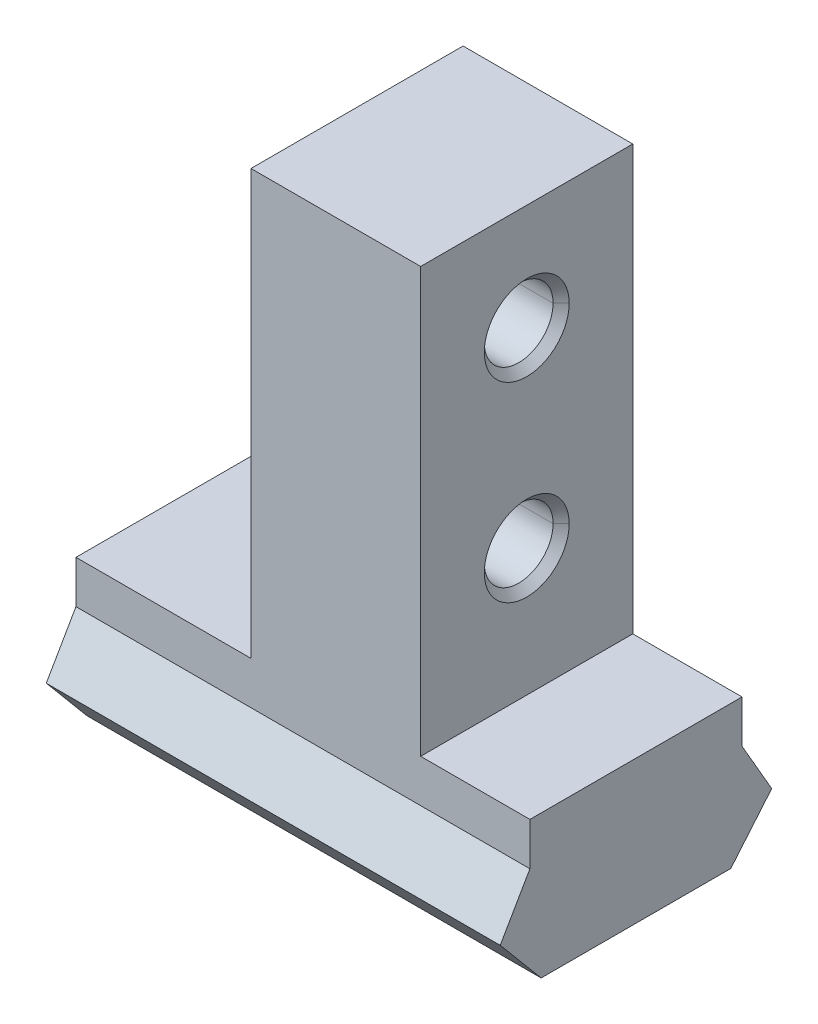
ISO-10303-21;
HEADER;
FILE_DESCRIPTION(('STEP AP214'),'2;1');
FILE_NAME('part.step','',(''),(''),'','','');
FILE_SCHEMA(('AUTOMOTIVE_DESIGN { 1 0 10303 214 1 1 1 1 }'));
ENDSEC;
DATA;
#1=APPLICATION_CONTEXT('core data for automotive mechanical design processes');
#2=APPLICATION_PROTOCOL_DEFINITION('international standard','automotive_design',2000,#1);
#3=PRODUCT_CONTEXT('',#1,'mechanical');
#4=PRODUCT('Part','Part','',(#3));
#5=PRODUCT_RELATED_PRODUCT_CATEGORY('part','',(#4));
#6=PRODUCT_DEFINITION_FORMATION('','',#4);
#7=PRODUCT_DEFINITION_CONTEXT('part definition',#1,'design');
#8=PRODUCT_DEFINITION('design','',#6,#7);
#9=PRODUCT_DEFINITION_SHAPE('','',#8);
#10=(LENGTH_UNIT() NAMED_UNIT(*) SI_UNIT(.MILLI.,.METRE.));
#11=(NAMED_UNIT(*) PLANE_ANGLE_UNIT() SI_UNIT($,.RADIAN.));
#12=(NAMED_UNIT(*) SI_UNIT($,.STERADIAN.) SOLID_ANGLE_UNIT());
#13=UNCERTAINTY_MEASURE_WITH_UNIT(LENGTH_MEASURE(1.E-05),#10,'distance_accuracy_value','');
#14=(GEOMETRIC_REPRESENTATION_CONTEXT(3) GLOBAL_UNCERTAINTY_ASSIGNED_CONTEXT((#13)) GLOBAL_UNIT_ASSIGNED_CONTEXT((#10,
#11,#12)) REPRESENTATION_CONTEXT('',''));
#15=CARTESIAN_POINT('',(0.,0.,0.));
#16=DIRECTION('',(0.,0.,1.));
#17=DIRECTION('',(1.,0.,0.));
#18=AXIS2_PLACEMENT_3D('',#15,#16,#17);
#19=CARTESIAN_POINT('',(21.4,4.44,-5.));
#20=DIRECTION('',(0.,-1.,0.));
#21=DIRECTION('',(0.,0.,-1.));
#22=AXIS2_PLACEMENT_3D('',#19,#20,#21);
#23=PLANE('',#22);
#24=DIRECTION('',(0.,0.,1.));
#25=VECTOR('',#24,1.);
#26=CARTESIAN_POINT('',(8.25,4.44,-5.));
#27=LINE('',#26,#25);
#28=CARTESIAN_POINT('',(8.25,4.44,-5.));
#29=VERTEX_POINT('',#28);
#30=CARTESIAN_POINT('',(8.25,4.44,5.));
#31=VERTEX_POINT('',#30);
#32=EDGE_CURVE('E10',#29,#31,#27,.T.);
#33=ORIENTED_EDGE('',*,*,#32,.F.);
#34=DIRECTION('',(-1.,0.,0.));
#35=VECTOR('',#34,1.);
#36=CARTESIAN_POINT('',(21.4,4.44,-5.));
#37=LINE('',#36,#35);
#38=CARTESIAN_POINT('',(0.,4.44,-5.));
#39=VERTEX_POINT('',#38);
#40=EDGE_CURVE('E23',#29,#39,#37,.T.);
#41=ORIENTED_EDGE('',*,*,#40,.T.);
#42=DIRECTION('',(0.,0.,1.));
#43=VECTOR('',#42,1.);
#44=CARTESIAN_POINT('',(0.,4.44,-5.));
#45=LINE('',#44,#43);
#46=CARTESIAN_POINT('',(0.,4.44,5.));
#47=VERTEX_POINT('',#46);
#48=EDGE_CURVE('E414',#39,#47,#45,.T.);
#49=ORIENTED_EDGE('',*,*,#48,.T.);
#50=DIRECTION('',(-1.,0.,0.));
#51=VECTOR('',#50,1.);
#52=CARTESIAN_POINT('',(21.4,4.44,5.));
#53=LINE('',#52,#51);
#54=EDGE_CURVE('E409',#31,#47,#53,.T.);
#55=ORIENTED_EDGE('',*,*,#54,.F.);
#56=EDGE_LOOP('',(#33,#41,#49,#55));
#57=FACE_BOUND('',#56,.T.);
#58=ADVANCED_FACE('F15',(#57),#23,.F.);
#59=CARTESIAN_POINT('',(21.4,4.44,5.));
#60=DIRECTION('',(0.,0.,-1.));
#61=DIRECTION('',(-1.,0.,0.));
#62=AXIS2_PLACEMENT_3D('',#59,#60,#61);
#63=PLANE('',#62);
#64=DIRECTION('',(-1.,0.,0.));
#65=VECTOR('',#64,1.);
#66=CARTESIAN_POINT('',(21.4,4.44,5.));
#67=LINE('',#66,#65);
#68=CARTESIAN_POINT('',(21.4,4.44,5.));
#69=VERTEX_POINT('',#68);
#70=CARTESIAN_POINT('',(16.25,4.44,5.));
#71=VERTEX_POINT('',#70);
#72=EDGE_CURVE('E405',#69,#71,#67,.T.);
#73=ORIENTED_EDGE('',*,*,#72,.T.);
#74=DIRECTION('',(0.,-1.,0.));
#75=VECTOR('',#74,1.);
#76=CARTESIAN_POINT('',(16.25,24.44,5.));
#77=LINE('',#76,#75);
#78=CARTESIAN_POINT('',(16.25,24.44,5.));
#79=VERTEX_POINT('',#78);
#80=EDGE_CURVE('E400',#79,#71,#77,.T.);
#81=ORIENTED_EDGE('',*,*,#80,.F.);
#82=DIRECTION('',(-1.,0.,0.));
#83=VECTOR('',#82,1.);
#84=CARTESIAN_POINT('',(16.25,24.44,5.));
#85=LINE('',#84,#83);
#86=CARTESIAN_POINT('',(8.25,24.44,5.));
#87=VERTEX_POINT('',#86);
#88=EDGE_CURVE('E396',#79,#87,#85,.T.);
#89=ORIENTED_EDGE('',*,*,#88,.T.);
#90=DIRECTION('',(0.,-1.,0.));
#91=VECTOR('',#90,1.);
#92=CARTESIAN_POINT('',(8.25,24.44,5.));
#93=LINE('',#92,#91);
#94=EDGE_CURVE('E391',#87,#31,#93,.T.);
#95=ORIENTED_EDGE('',*,*,#94,.T.);
#96=ORIENTED_EDGE('',*,*,#54,.T.);
#97=DIRECTION('',(0.,-1.,0.));
#98=VECTOR('',#97,1.);
#99=CARTESIAN_POINT('',(0.,4.44,5.));
#100=LINE('',#99,#98);
#101=CARTESIAN_POINT('',(0.,2.4248711305964,5.));
#102=VERTEX_POINT('',#101);
#103=EDGE_CURVE('E387',#47,#102,#100,.T.);
#104=ORIENTED_EDGE('',*,*,#103,.T.);
#105=DIRECTION('',(-1.,0.,0.));
#106=VECTOR('',#105,1.);
#107=CARTESIAN_POINT('',(21.4,2.4248711305964,5.));
#108=LINE('',#107,#106);
#109=CARTESIAN_POINT('',(21.4,2.4248711305964,5.));
#110=VERTEX_POINT('',#109);
#111=EDGE_CURVE('E172',#110,#102,#108,.T.);
#112=ORIENTED_EDGE('',*,*,#111,.F.);
#113=DIRECTION('',(0.,-1.,0.));
#114=VECTOR('',#113,1.);
#115=CARTESIAN_POINT('',(21.4,4.44,5.));
#116=LINE('',#115,#114);
#117=EDGE_CURVE('E379',#69,#110,#116,.T.);
#118=ORIENTED_EDGE('',*,*,#117,.F.);
#119=EDGE_LOOP('',(#73,#81,#89,#95,#96,#104,#112,#118));
#120=FACE_BOUND('',#119,.T.);
#121=ADVANCED_FACE('F425',(#120),#63,.F.);
#122=CARTESIAN_POINT('',(21.4,0.,0.));
#123=DIRECTION('',(1.,0.,0.));
#124=DIRECTION('',(0.,0.,-1.));
#125=AXIS2_PLACEMENT_3D('',#122,#123,#124);
#126=PLANE('',#125);
#127=DIRECTION('',(0.,-0.866025403784438,0.500000000000001));
#128=VECTOR('',#127,1.);
#129=CARTESIAN_POINT('',(21.4,2.4248711305964,5.));
#130=LINE('',#129,#128);
#131=CARTESIAN_POINT('',(21.4,0.,6.4));
#132=VERTEX_POINT('',#131);
#133=EDGE_CURVE('E375',#110,#132,#130,.T.);
#134=ORIENTED_EDGE('',*,*,#133,.T.);
#135=DIRECTION('',(0.,-0.766044443118985,-0.642787609686531));
#136=VECTOR('',#135,1.);
#137=CARTESIAN_POINT('',(21.4,0.,6.4));
#138=LINE('',#137,#136);
#139=CARTESIAN_POINT('',(21.4,-2.3,4.4700708482923));
#140=VERTEX_POINT('',#139);
#141=EDGE_CURVE('E166',#132,#140,#138,.T.);
#142=ORIENTED_EDGE('',*,*,#141,.T.);
#143=DIRECTION('',(0.,0.,-1.));
#144=VECTOR('',#143,1.);
#145=CARTESIAN_POINT('',(21.4,-2.3,4.4700708482923));
#146=LINE('',#145,#144);
#147=CARTESIAN_POINT('',(21.4,-2.3,-4.4700708482923));
#148=VERTEX_POINT('',#147);
#149=EDGE_CURVE('E368',#140,#148,#146,.T.);
#150=ORIENTED_EDGE('',*,*,#149,.T.);
#151=DIRECTION('',(0.,0.766044443118985,-0.642787609686531));
#152=VECTOR('',#151,1.);
#153=CARTESIAN_POINT('',(21.4,-2.3,-4.4700708482923));
#154=LINE('',#153,#152);
#155=CARTESIAN_POINT('',(21.4,0.,-6.4));
#156=VERTEX_POINT('',#155);
#157=EDGE_CURVE('E364',#148,#156,#154,.T.);
#158=ORIENTED_EDGE('',*,*,#157,.T.);
#159=DIRECTION('',(0.,0.866025403784438,0.500000000000001));
#160=VECTOR('',#159,1.);
#161=CARTESIAN_POINT('',(21.4,0.,-6.4));
#162=LINE('',#161,#160);
#163=CARTESIAN_POINT('',(21.4,2.4248711305964,-5.));
#164=VERTEX_POINT('',#163);
#165=EDGE_CURVE('E360',#156,#164,#162,.T.);
#166=ORIENTED_EDGE('',*,*,#165,.T.);
#167=DIRECTION('',(0.,1.,0.));
#168=VECTOR('',#167,1.);
#169=CARTESIAN_POINT('',(21.4,2.4248711305964,-5.));
#170=LINE('',#169,#168);
#171=CARTESIAN_POINT('',(21.4,4.44,-5.));
#172=VERTEX_POINT('',#171);
#173=EDGE_CURVE('E356',#164,#172,#170,.T.);
#174=ORIENTED_EDGE('',*,*,#173,.T.);
#175=DIRECTION('',(0.,0.,1.));
#176=VECTOR('',#175,1.);
#177=CARTESIAN_POINT('',(21.4,4.44,-5.));
#178=LINE('',#177,#176);
#179=EDGE_CURVE('E351',#172,#69,#178,.T.);
#180=ORIENTED_EDGE('',*,*,#179,.T.);
#181=ORIENTED_EDGE('',*,*,#117,.T.);
#182=EDGE_LOOP('',(#134,#142,#150,#158,#166,#174,#180,#181));
#183=FACE_BOUND('',#182,.T.);
#184=ADVANCED_FACE('F471',(#183),#126,.T.);
#185=CARTESIAN_POINT('',(21.4,4.44,-5.));
#186=DIRECTION('',(0.,-1.,0.));
#187=DIRECTION('',(0.,0.,-1.));
#188=AXIS2_PLACEMENT_3D('',#185,#186,#187);
#189=PLANE('',#188);
#190=DIRECTION('',(-1.,0.,0.));
#191=VECTOR('',#190,1.);
#192=CARTESIAN_POINT('',(21.4,4.44,-5.));
#193=LINE('',#192,#191);
#194=CARTESIAN_POINT('',(16.25,4.44,-5.));
#195=VERTEX_POINT('',#194);
#196=EDGE_CURVE('E347',#172,#195,#193,.T.);
#197=ORIENTED_EDGE('',*,*,#196,.T.);
#198=DIRECTION('',(0.,0.,1.));
#199=VECTOR('',#198,1.);
#200=CARTESIAN_POINT('',(16.25,4.44,-5.));
#201=LINE('',#200,#199);
#202=EDGE_CURVE('E342',#195,#71,#201,.T.);
#203=ORIENTED_EDGE('',*,*,#202,.T.);
#204=ORIENTED_EDGE('',*,*,#72,.F.);
#205=ORIENTED_EDGE('',*,*,#179,.F.);
#206=EDGE_LOOP('',(#197,#203,#204,#205));
#207=FACE_BOUND('',#206,.T.);
#208=ADVANCED_FACE('F476',(#207),#189,.F.);
#209=CARTESIAN_POINT('',(16.25,0.,0.));
#210=DIRECTION('',(1.,0.,0.));
#211=DIRECTION('',(0.,0.,-1.));
#212=AXIS2_PLACEMENT_3D('',#209,#210,#211);
#213=PLANE('',#212);
#214=CARTESIAN_POINT('',(16.25,10.44,0.));
#215=DIRECTION('',(1.,0.,0.));
#216=DIRECTION('',(0.,0.,-1.));
#217=AXIS2_PLACEMENT_3D('',#214,#215,#216);
#218=CIRCLE('',#217,2.);
#219=CARTESIAN_POINT('',(16.25,10.44,2.));
#220=VERTEX_POINT('',#219);
#221=CARTESIAN_POINT('',(16.25,10.44,-2.));
#222=VERTEX_POINT('',#221);
#223=EDGE_CURVE('E337',#220,#222,#218,.T.);
#224=ORIENTED_EDGE('',*,*,#223,.F.);
#225=CARTESIAN_POINT('',(16.25,10.44,0.));
#226=DIRECTION('',(1.,0.,0.));
#227=DIRECTION('',(0.,0.,-1.));
#228=AXIS2_PLACEMENT_3D('',#225,#226,#227);
#229=CIRCLE('',#228,2.);
#230=EDGE_CURVE('E332',#222,#220,#229,.T.);
#231=ORIENTED_EDGE('',*,*,#230,.F.);
#232=EDGE_LOOP('',(#224,#231));
#233=FACE_BOUND('',#232,.T.);
#234=CARTESIAN_POINT('',(16.25,19.44,0.));
#235=DIRECTION('',(1.,0.,0.));
#236=DIRECTION('',(0.,0.,-1.));
#237=AXIS2_PLACEMENT_3D('',#234,#235,#236);
#238=CIRCLE('',#237,2.);
#239=CARTESIAN_POINT('',(16.25,19.44,2.));
#240=VERTEX_POINT('',#239);
#241=CARTESIAN_POINT('',(16.25,19.44,-2.));
#242=VERTEX_POINT('',#241);
#243=EDGE_CURVE('E327',#240,#242,#238,.T.);
#244=ORIENTED_EDGE('',*,*,#243,.F.);
#245=CARTESIAN_POINT('',(16.25,19.44,0.));
#246=DIRECTION('',(1.,0.,0.));
#247=DIRECTION('',(0.,0.,-1.));
#248=AXIS2_PLACEMENT_3D('',#245,#246,#247);
#249=CIRCLE('',#248,2.);
#250=EDGE_CURVE('E322',#242,#240,#249,.T.);
#251=ORIENTED_EDGE('',*,*,#250,.F.);
#252=EDGE_LOOP('',(#244,#251));
#253=FACE_BOUND('',#252,.T.);
#254=ORIENTED_EDGE('',*,*,#202,.F.);
#255=DIRECTION('',(0.,1.,0.));
#256=VECTOR('',#255,1.);
#257=CARTESIAN_POINT('',(16.25,0.,-5.));
#258=LINE('',#257,#256);
#259=CARTESIAN_POINT('',(16.25,24.44,-5.));
#260=VERTEX_POINT('',#259);
#261=EDGE_CURVE('E318',#195,#260,#258,.T.);
#262=ORIENTED_EDGE('',*,*,#261,.T.);
#263=DIRECTION('',(0.,0.,1.));
#264=VECTOR('',#263,1.);
#265=CARTESIAN_POINT('',(16.25,24.44,-5.));
#266=LINE('',#265,#264);
#267=EDGE_CURVE('E313',#260,#79,#266,.T.);
#268=ORIENTED_EDGE('',*,*,#267,.T.);
#269=ORIENTED_EDGE('',*,*,#80,.T.);
#270=EDGE_LOOP('',(#254,#262,#268,#269));
#271=FACE_BOUND('',#270,.T.);
#272=ADVANCED_FACE('F480',(#233,#253,#271),#213,.T.);
#273=CARTESIAN_POINT('',(16.25,24.44,-5.));
#274=DIRECTION('',(0.,-1.,0.));
#275=DIRECTION('',(0.,0.,-1.));
#276=AXIS2_PLACEMENT_3D('',#273,#274,#275);
#277=PLANE('',#276);
#278=DIRECTION('',(0.,0.,1.));
#279=VECTOR('',#278,1.);
#280=CARTESIAN_POINT('',(8.25,24.44,-5.));
#281=LINE('',#280,#279);
#282=CARTESIAN_POINT('',(8.25,24.44,-5.));
#283=VERTEX_POINT('',#282);
#284=EDGE_CURVE('E308',#283,#87,#281,.T.);
#285=ORIENTED_EDGE('',*,*,#284,.T.);
#286=ORIENTED_EDGE('',*,*,#88,.F.);
#287=ORIENTED_EDGE('',*,*,#267,.F.);
#288=DIRECTION('',(-1.,0.,0.));
#289=VECTOR('',#288,1.);
#290=CARTESIAN_POINT('',(16.25,24.44,-5.));
#291=LINE('',#290,#289);
#292=EDGE_CURVE('E304',#260,#283,#291,.T.);
#293=ORIENTED_EDGE('',*,*,#292,.T.);
#294=EDGE_LOOP('',(#285,#286,#287,#293));
#295=FACE_BOUND('',#294,.T.);
#296=ADVANCED_FACE('F483',(#295),#277,.F.);
#297=CARTESIAN_POINT('',(21.4,2.4248711305964,-5.));
#298=DIRECTION('',(0.,0.,1.));
#299=DIRECTION('',(1.,0.,0.));
#300=AXIS2_PLACEMENT_3D('',#297,#298,#299);
#301=PLANE('',#300);
#302=DIRECTION('',(-1.,0.,0.));
#303=VECTOR('',#302,1.);
#304=CARTESIAN_POINT('',(21.4,2.4248711305964,-5.));
#305=LINE('',#304,#303);
#306=CARTESIAN_POINT('',(0.,2.4248711305964,-5.));
#307=VERTEX_POINT('',#306);
#308=EDGE_CURVE('E300',#164,#307,#305,.T.);
#309=ORIENTED_EDGE('',*,*,#308,.T.);
#310=DIRECTION('',(0.,1.,0.));
#311=VECTOR('',#310,1.);
#312=CARTESIAN_POINT('',(0.,2.4248711305964,-5.));
#313=LINE('',#312,#311);
#314=EDGE_CURVE('E296',#307,#39,#313,.T.);
#315=ORIENTED_EDGE('',*,*,#314,.T.);
#316=ORIENTED_EDGE('',*,*,#40,.F.);
#317=DIRECTION('',(0.,1.,0.));
#318=VECTOR('',#317,1.);
#319=CARTESIAN_POINT('',(8.25,0.,-5.));
#320=LINE('',#319,#318);
#321=EDGE_CURVE('E291',#29,#283,#320,.T.);
#322=ORIENTED_EDGE('',*,*,#321,.T.);
#323=ORIENTED_EDGE('',*,*,#292,.F.);
#324=ORIENTED_EDGE('',*,*,#261,.F.);
#325=ORIENTED_EDGE('',*,*,#196,.F.);
#326=ORIENTED_EDGE('',*,*,#173,.F.);
#327=EDGE_LOOP('',(#309,#315,#316,#322,#323,#324,#325,#326));
#328=FACE_BOUND('',#327,.T.);
#329=ADVANCED_FACE('F433',(#328),#301,.F.);
#330=CARTESIAN_POINT('',(8.25,0.,0.));
#331=DIRECTION('',(1.,0.,0.));
#332=DIRECTION('',(0.,0.,-1.));
#333=AXIS2_PLACEMENT_3D('',#330,#331,#332);
#334=PLANE('',#333);
#335=CARTESIAN_POINT('',(8.25,10.44,0.));
#336=DIRECTION('',(1.,0.,0.));
#337=DIRECTION('',(0.,0.,-1.));
#338=AXIS2_PLACEMENT_3D('',#335,#336,#337);
#339=CIRCLE('',#338,2.);
#340=CARTESIAN_POINT('',(8.25,10.44,-2.));
#341=VERTEX_POINT('',#340);
#342=CARTESIAN_POINT('',(8.25,10.44,2.));
#343=VERTEX_POINT('',#342);
#344=EDGE_CURVE('E287',#341,#343,#339,.T.);
#345=ORIENTED_EDGE('',*,*,#344,.T.);
#346=CARTESIAN_POINT('',(8.25,10.44,0.));
#347=DIRECTION('',(1.,0.,0.));
#348=DIRECTION('',(0.,0.,-1.));
#349=AXIS2_PLACEMENT_3D('',#346,#347,#348);
#350=CIRCLE('',#349,2.);
#351=EDGE_CURVE('E283',#343,#341,#350,.T.);
#352=ORIENTED_EDGE('',*,*,#351,.T.);
#353=EDGE_LOOP('',(#345,#352));
#354=FACE_BOUND('',#353,.T.);
#355=CARTESIAN_POINT('',(8.25,19.44,0.));
#356=DIRECTION('',(1.,0.,0.));
#357=DIRECTION('',(0.,0.,-1.));
#358=AXIS2_PLACEMENT_3D('',#355,#356,#357);
#359=CIRCLE('',#358,2.);
#360=CARTESIAN_POINT('',(8.25,19.44,-2.));
#361=VERTEX_POINT('',#360);
#362=CARTESIAN_POINT('',(8.25,19.44,2.));
#363=VERTEX_POINT('',#362);
#364=EDGE_CURVE('E279',#361,#363,#359,.T.);
#365=ORIENTED_EDGE('',*,*,#364,.T.);
#366=CARTESIAN_POINT('',(8.25,19.44,0.));
#367=DIRECTION('',(1.,0.,0.));
#368=DIRECTION('',(0.,0.,-1.));
#369=AXIS2_PLACEMENT_3D('',#366,#367,#368);
#370=CIRCLE('',#369,2.);
#371=EDGE_CURVE('E275',#363,#361,#370,.T.);
#372=ORIENTED_EDGE('',*,*,#371,.T.);
#373=EDGE_LOOP('',(#365,#372));
#374=FACE_BOUND('',#373,.T.);
#375=ORIENTED_EDGE('',*,*,#321,.F.);
#376=ORIENTED_EDGE('',*,*,#32,.T.);
#377=ORIENTED_EDGE('',*,*,#94,.F.);
#378=ORIENTED_EDGE('',*,*,#284,.F.);
#379=EDGE_LOOP('',(#375,#376,#377,#378));
#380=FACE_BOUND('',#379,.T.);
#381=ADVANCED_FACE('F430',(#354,#374,#380),#334,.F.);
#382=CARTESIAN_POINT('',(8.25,19.44,0.));
#383=DIRECTION('',(-1.,0.,0.));
#384=DIRECTION('',(0.,1.,0.));
#385=AXIS2_PLACEMENT_3D('',#382,#383,#384);
#386=CONICAL_SURFACE('',#385,2.,0.78539816339745);
#387=DIRECTION('',(-0.707106781186547,0.,-0.707106781186548));
#388=VECTOR('',#387,1.);
#389=CARTESIAN_POINT('',(8.629,19.44,-1.621));
#390=LINE('',#389,#388);
#391=CARTESIAN_POINT('',(8.629,19.44,-1.621));
#392=VERTEX_POINT('',#391);
#393=EDGE_CURVE('E270',#392,#361,#390,.T.);
#394=ORIENTED_EDGE('',*,*,#393,.T.);
#395=ORIENTED_EDGE('',*,*,#371,.F.);
#396=DIRECTION('',(-0.707106781186547,0.,0.707106781186548));
#397=VECTOR('',#396,1.);
#398=CARTESIAN_POINT('',(8.629,19.44,1.621));
#399=LINE('',#398,#397);
#400=CARTESIAN_POINT('',(8.629,19.44,1.621));
#401=VERTEX_POINT('',#400);
#402=EDGE_CURVE('E265',#401,#363,#399,.T.);
#403=ORIENTED_EDGE('',*,*,#402,.F.);
#404=CARTESIAN_POINT('',(8.629,19.44,0.));
#405=DIRECTION('',(1.,0.,0.));
#406=DIRECTION('',(0.,0.,-1.));
#407=AXIS2_PLACEMENT_3D('',#404,#405,#406);
#408=CIRCLE('',#407,1.621);
#409=EDGE_CURVE('E261',#401,#392,#408,.T.);
#410=ORIENTED_EDGE('',*,*,#409,.T.);
#411=EDGE_LOOP('',(#394,#395,#403,#410));
#412=FACE_BOUND('',#411,.T.);
#413=ADVANCED_FACE('F536',(#412),#386,.F.);
#414=CARTESIAN_POINT('',(16.25,19.44,0.));
#415=DIRECTION('',(1.,0.,0.));
#416=DIRECTION('',(0.,1.,0.));
#417=AXIS2_PLACEMENT_3D('',#414,#415,#416);
#418=CYLINDRICAL_SURFACE('',#417,1.621);
#419=DIRECTION('',(1.,0.,0.));
#420=VECTOR('',#419,1.);
#421=CARTESIAN_POINT('',(8.629,19.44,1.621));
#422=LINE('',#421,#420);
#423=CARTESIAN_POINT('',(15.871,19.44,1.621));
#424=VERTEX_POINT('',#423);
#425=EDGE_CURVE('E257',#401,#424,#422,.T.);
#426=ORIENTED_EDGE('',*,*,#425,.T.);
#427=CARTESIAN_POINT('',(15.871,19.44,0.));
#428=DIRECTION('',(1.,0.,0.));
#429=DIRECTION('',(0.,0.,-1.));
#430=AXIS2_PLACEMENT_3D('',#427,#428,#429);
#431=CIRCLE('',#430,1.621);
#432=CARTESIAN_POINT('',(15.871,19.44,-1.621));
#433=VERTEX_POINT('',#432);
#434=EDGE_CURVE('E253',#424,#433,#431,.T.);
#435=ORIENTED_EDGE('',*,*,#434,.T.);
#436=DIRECTION('',(1.,0.,0.));
#437=VECTOR('',#436,1.);
#438=CARTESIAN_POINT('',(8.629,19.44,-1.621));
#439=LINE('',#438,#437);
#440=EDGE_CURVE('E248',#392,#433,#439,.T.);
#441=ORIENTED_EDGE('',*,*,#440,.F.);
#442=ORIENTED_EDGE('',*,*,#409,.F.);
#443=EDGE_LOOP('',(#426,#435,#441,#442));
#444=FACE_BOUND('',#443,.T.);
#445=ADVANCED_FACE('F546',(#444),#418,.F.);
#446=CARTESIAN_POINT('',(16.25,19.44,0.));
#447=DIRECTION('',(1.,0.,0.));
#448=DIRECTION('',(0.,-1.,0.));
#449=AXIS2_PLACEMENT_3D('',#446,#447,#448);
#450=CYLINDRICAL_SURFACE('',#449,1.621);
#451=ORIENTED_EDGE('',*,*,#425,.F.);
#452=CARTESIAN_POINT('',(8.629,19.44,0.));
#453=DIRECTION('',(1.,0.,0.));
#454=DIRECTION('',(0.,0.,-1.));
#455=AXIS2_PLACEMENT_3D('',#452,#453,#454);
#456=CIRCLE('',#455,1.621);
#457=EDGE_CURVE('E243',#392,#401,#456,.T.);
#458=ORIENTED_EDGE('',*,*,#457,.F.);
#459=ORIENTED_EDGE('',*,*,#440,.T.);
#460=CARTESIAN_POINT('',(15.871,19.44,0.));
#461=DIRECTION('',(1.,0.,0.));
#462=DIRECTION('',(0.,0.,-1.));
#463=AXIS2_PLACEMENT_3D('',#460,#461,#462);
#464=CIRCLE('',#463,1.621);
#465=EDGE_CURVE('E238',#433,#424,#464,.T.);
#466=ORIENTED_EDGE('',*,*,#465,.T.);
#467=EDGE_LOOP('',(#451,#458,#459,#466));
#468=FACE_BOUND('',#467,.T.);
#469=ADVANCED_FACE('F556',(#468),#450,.F.);
#470=CARTESIAN_POINT('',(15.871,19.44,0.));
#471=DIRECTION('',(1.,0.,0.));
#472=DIRECTION('',(0.,-1.,0.));
#473=AXIS2_PLACEMENT_3D('',#470,#471,#472);
#474=CONICAL_SURFACE('',#473,1.621,0.785398163397448);
#475=DIRECTION('',(0.707106781186548,0.,0.707106781186547));
#476=VECTOR('',#475,1.);
#477=CARTESIAN_POINT('',(15.871,19.44,1.621));
#478=LINE('',#477,#476);
#479=EDGE_CURVE('E233',#424,#240,#478,.T.);
#480=ORIENTED_EDGE('',*,*,#479,.F.);
#481=ORIENTED_EDGE('',*,*,#465,.F.);
#482=DIRECTION('',(0.707106781186548,0.,-0.707106781186547));
#483=VECTOR('',#482,1.);
#484=CARTESIAN_POINT('',(15.871,19.44,-1.621));
#485=LINE('',#484,#483);
#486=EDGE_CURVE('E228',#433,#242,#485,.T.);
#487=ORIENTED_EDGE('',*,*,#486,.T.);
#488=ORIENTED_EDGE('',*,*,#250,.T.);
#489=EDGE_LOOP('',(#480,#481,#487,#488));
#490=FACE_BOUND('',#489,.T.);
#491=ADVANCED_FACE('F566',(#490),#474,.F.);
#492=CARTESIAN_POINT('',(15.871,19.44,0.));
#493=DIRECTION('',(1.,0.,0.));
#494=DIRECTION('',(0.,1.,0.));
#495=AXIS2_PLACEMENT_3D('',#492,#493,#494);
#496=CONICAL_SURFACE('',#495,1.621,0.785398163397448);
#497=ORIENTED_EDGE('',*,*,#479,.T.);
#498=ORIENTED_EDGE('',*,*,#243,.T.);
#499=ORIENTED_EDGE('',*,*,#486,.F.);
#500=ORIENTED_EDGE('',*,*,#434,.F.);
#501=EDGE_LOOP('',(#497,#498,#499,#500));
#502=FACE_BOUND('',#501,.T.);
#503=ADVANCED_FACE('F576',(#502),#496,.F.);
#504=CARTESIAN_POINT('',(8.25,19.44,0.));
#505=DIRECTION('',(-1.,0.,0.));
#506=DIRECTION('',(0.,-1.,0.));
#507=AXIS2_PLACEMENT_3D('',#504,#505,#506);
#508=CONICAL_SURFACE('',#507,2.,0.78539816339745);
#509=ORIENTED_EDGE('',*,*,#393,.F.);
#510=ORIENTED_EDGE('',*,*,#457,.T.);
#511=ORIENTED_EDGE('',*,*,#402,.T.);
#512=ORIENTED_EDGE('',*,*,#364,.F.);
#513=EDGE_LOOP('',(#509,#510,#511,#512));
#514=FACE_BOUND('',#513,.T.);
#515=ADVANCED_FACE('F586',(#514),#508,.F.);
#516=CARTESIAN_POINT('',(8.25,10.44,0.));
#517=DIRECTION('',(-1.,0.,0.));
#518=DIRECTION('',(0.,1.,0.));
#519=AXIS2_PLACEMENT_3D('',#516,#517,#518);
#520=CONICAL_SURFACE('',#519,2.,0.785398163397448);
#521=DIRECTION('',(-0.707106781186547,0.,-0.707106781186548));
#522=VECTOR('',#521,1.);
#523=CARTESIAN_POINT('',(8.629,10.44,-1.621));
#524=LINE('',#523,#522);
#525=CARTESIAN_POINT('',(8.629,10.44,-1.621));
#526=VERTEX_POINT('',#525);
#527=EDGE_CURVE('E223',#526,#341,#524,.T.);
#528=ORIENTED_EDGE('',*,*,#527,.T.);
#529=ORIENTED_EDGE('',*,*,#351,.F.);
#530=DIRECTION('',(-0.707106781186547,0.,0.707106781186548));
#531=VECTOR('',#530,1.);
#532=CARTESIAN_POINT('',(8.629,10.44,1.621));
#533=LINE('',#532,#531);
#534=CARTESIAN_POINT('',(8.629,10.44,1.621));
#535=VERTEX_POINT('',#534);
#536=EDGE_CURVE('E218',#535,#343,#533,.T.);
#537=ORIENTED_EDGE('',*,*,#536,.F.);
#538=CARTESIAN_POINT('',(8.629,10.44,0.));
#539=DIRECTION('',(1.,0.,0.));
#540=DIRECTION('',(0.,0.,-1.));
#541=AXIS2_PLACEMENT_3D('',#538,#539,#540);
#542=CIRCLE('',#541,1.621);
#543=EDGE_CURVE('E214',#535,#526,#542,.T.);
#544=ORIENTED_EDGE('',*,*,#543,.T.);
#545=EDGE_LOOP('',(#528,#529,#537,#544));
#546=FACE_BOUND('',#545,.T.);
#547=ADVANCED_FACE('F596',(#546),#520,.F.);
#548=CARTESIAN_POINT('',(16.25,10.44,0.));
#549=DIRECTION('',(1.,0.,0.));
#550=DIRECTION('',(0.,1.,0.));
#551=AXIS2_PLACEMENT_3D('',#548,#549,#550);
#552=CYLINDRICAL_SURFACE('',#551,1.621);
#553=DIRECTION('',(1.,0.,0.));
#554=VECTOR('',#553,1.);
#555=CARTESIAN_POINT('',(8.629,10.44,1.621));
#556=LINE('',#555,#554);
#557=CARTESIAN_POINT('',(15.871,10.44,1.621));
#558=VERTEX_POINT('',#557);
#559=EDGE_CURVE('E210',#535,#558,#556,.T.);
#560=ORIENTED_EDGE('',*,*,#559,.T.);
#561=CARTESIAN_POINT('',(15.871,10.44,0.));
#562=DIRECTION('',(1.,0.,0.));
#563=DIRECTION('',(0.,0.,-1.));
#564=AXIS2_PLACEMENT_3D('',#561,#562,#563);
#565=CIRCLE('',#564,1.621);
#566=CARTESIAN_POINT('',(15.871,10.44,-1.621));
#567=VERTEX_POINT('',#566);
#568=EDGE_CURVE('E206',#558,#567,#565,.T.);
#569=ORIENTED_EDGE('',*,*,#568,.T.);
#570=DIRECTION('',(1.,0.,0.));
#571=VECTOR('',#570,1.);
#572=CARTESIAN_POINT('',(8.629,10.44,-1.621));
#573=LINE('',#572,#571);
#574=EDGE_CURVE('E201',#526,#567,#573,.T.);
#575=ORIENTED_EDGE('',*,*,#574,.F.);
#576=ORIENTED_EDGE('',*,*,#543,.F.);
#577=EDGE_LOOP('',(#560,#569,#575,#576));
#578=FACE_BOUND('',#577,.T.);
#579=ADVANCED_FACE('F606',(#578),#552,.F.);
#580=CARTESIAN_POINT('',(16.25,10.44,0.));
#581=DIRECTION('',(1.,0.,0.));
#582=DIRECTION('',(0.,-1.,0.));
#583=AXIS2_PLACEMENT_3D('',#580,#581,#582);
#584=CYLINDRICAL_SURFACE('',#583,1.621);
#585=ORIENTED_EDGE('',*,*,#559,.F.);
#586=CARTESIAN_POINT('',(8.629,10.44,0.));
#587=DIRECTION('',(1.,0.,0.));
#588=DIRECTION('',(0.,0.,-1.));
#589=AXIS2_PLACEMENT_3D('',#586,#587,#588);
#590=CIRCLE('',#589,1.621);
#591=EDGE_CURVE('E196',#526,#535,#590,.T.);
#592=ORIENTED_EDGE('',*,*,#591,.F.);
#593=ORIENTED_EDGE('',*,*,#574,.T.);
#594=CARTESIAN_POINT('',(15.871,10.44,0.));
#595=DIRECTION('',(1.,0.,0.));
#596=DIRECTION('',(0.,0.,-1.));
#597=AXIS2_PLACEMENT_3D('',#594,#595,#596);
#598=CIRCLE('',#597,1.621);
#599=EDGE_CURVE('E191',#567,#558,#598,.T.);
#600=ORIENTED_EDGE('',*,*,#599,.T.);
#601=EDGE_LOOP('',(#585,#592,#593,#600));
#602=FACE_BOUND('',#601,.T.);
#603=ADVANCED_FACE('F616',(#602),#584,.F.);
#604=CARTESIAN_POINT('',(15.871,10.44,0.));
#605=DIRECTION('',(1.,0.,0.));
#606=DIRECTION('',(0.,-1.,0.));
#607=AXIS2_PLACEMENT_3D('',#604,#605,#606);
#608=CONICAL_SURFACE('',#607,1.621,0.785398163397446);
#609=DIRECTION('',(0.707106781186548,0.,0.707106781186547));
#610=VECTOR('',#609,1.);
#611=CARTESIAN_POINT('',(15.871,10.44,1.621));
#612=LINE('',#611,#610);
#613=EDGE_CURVE('E177',#558,#220,#612,.T.);
#614=ORIENTED_EDGE('',*,*,#613,.F.);
#615=ORIENTED_EDGE('',*,*,#599,.F.);
#616=DIRECTION('',(0.707106781186548,0.,-0.707106781186547));
#617=VECTOR('',#616,1.);
#618=CARTESIAN_POINT('',(15.871,10.44,-1.621));
#619=LINE('',#618,#617);
#620=EDGE_CURVE('E173',#567,#222,#619,.T.);
#621=ORIENTED_EDGE('',*,*,#620,.T.);
#622=ORIENTED_EDGE('',*,*,#230,.T.);
#623=EDGE_LOOP('',(#614,#615,#621,#622));
#624=FACE_BOUND('',#623,.T.);
#625=ADVANCED_FACE('F626',(#624),#608,.F.);
#626=CARTESIAN_POINT('',(15.871,10.44,0.));
#627=DIRECTION('',(1.,0.,0.));
#628=DIRECTION('',(0.,1.,0.));
#629=AXIS2_PLACEMENT_3D('',#626,#627,#628);
#630=CONICAL_SURFACE('',#629,1.621,0.785398163397446);
#631=ORIENTED_EDGE('',*,*,#613,.T.);
#632=ORIENTED_EDGE('',*,*,#223,.T.);
#633=ORIENTED_EDGE('',*,*,#620,.F.);
#634=ORIENTED_EDGE('',*,*,#568,.F.);
#635=EDGE_LOOP('',(#631,#632,#633,#634));
#636=FACE_BOUND('',#635,.T.);
#637=ADVANCED_FACE('F636',(#636),#630,.F.);
#638=CARTESIAN_POINT('',(8.25,10.44,0.));
#639=DIRECTION('',(-1.,0.,0.));
#640=DIRECTION('',(0.,-1.,0.));
#641=AXIS2_PLACEMENT_3D('',#638,#639,#640);
#642=CONICAL_SURFACE('',#641,2.,0.785398163397448);
#643=ORIENTED_EDGE('',*,*,#527,.F.);
#644=ORIENTED_EDGE('',*,*,#591,.T.);
#645=ORIENTED_EDGE('',*,*,#536,.T.);
#646=ORIENTED_EDGE('',*,*,#344,.F.);
#647=EDGE_LOOP('',(#643,#644,#645,#646));
#648=FACE_BOUND('',#647,.T.);
#649=ADVANCED_FACE('F646',(#648),#642,.F.);
#650=CARTESIAN_POINT('',(0.,0.,0.));
#651=DIRECTION('',(1.,0.,0.));
#652=DIRECTION('',(0.,0.,-1.));
#653=AXIS2_PLACEMENT_3D('',#650,#651,#652);
#654=PLANE('',#653);
#655=DIRECTION('',(0.,-0.866025403784438,0.500000000000001));
#656=VECTOR('',#655,1.);
#657=CARTESIAN_POINT('',(0.,2.4248711305964,5.));
#658=LINE('',#657,#656);
#659=CARTESIAN_POINT('',(0.,0.,6.4));
#660=VERTEX_POINT('',#659);
#661=EDGE_CURVE('E153',#102,#660,#658,.T.);
#662=ORIENTED_EDGE('',*,*,#661,.F.);
#663=ORIENTED_EDGE('',*,*,#103,.F.);
#664=ORIENTED_EDGE('',*,*,#48,.F.);
#665=ORIENTED_EDGE('',*,*,#314,.F.);
#666=DIRECTION('',(0.,0.866025403784438,0.500000000000001));
#667=VECTOR('',#666,1.);
#668=CARTESIAN_POINT('',(0.,0.,-6.4));
#669=LINE('',#668,#667);
#670=CARTESIAN_POINT('',(0.,0.,-6.4));
#671=VERTEX_POINT('',#670);
#672=EDGE_CURVE('E174',#671,#307,#669,.T.);
#673=ORIENTED_EDGE('',*,*,#672,.F.);
#674=DIRECTION('',(0.,0.766044443118985,-0.642787609686531));
#675=VECTOR('',#674,1.);
#676=CARTESIAN_POINT('',(0.,-2.3,-4.4700708482923));
#677=LINE('',#676,#675);
#678=CARTESIAN_POINT('',(0.,-2.3,-4.4700708482923));
#679=VERTEX_POINT('',#678);
#680=EDGE_CURVE('E180',#679,#671,#677,.T.);
#681=ORIENTED_EDGE('',*,*,#680,.F.);
#682=DIRECTION('',(0.,0.,-1.));
#683=VECTOR('',#682,1.);
#684=CARTESIAN_POINT('',(0.,-2.3,4.4700708482923));
#685=LINE('',#684,#683);
#686=CARTESIAN_POINT('',(0.,-2.3,4.4700708482923));
#687=VERTEX_POINT('',#686);
#688=EDGE_CURVE('E156',#687,#679,#685,.T.);
#689=ORIENTED_EDGE('',*,*,#688,.F.);
#690=DIRECTION('',(0.,-0.766044443118985,-0.642787609686531));
#691=VECTOR('',#690,1.);
#692=CARTESIAN_POINT('',(0.,0.,6.4));
#693=LINE('',#692,#691);
#694=EDGE_CURVE('E148',#660,#687,#693,.T.);
#695=ORIENTED_EDGE('',*,*,#694,.F.);
#696=EDGE_LOOP('',(#662,#663,#664,#665,#673,#681,#689,#695));
#697=FACE_BOUND('',#696,.T.);
#698=ADVANCED_FACE('F150',(#697),#654,.F.);
#699=CARTESIAN_POINT('',(21.4,0.,6.4));
#700=DIRECTION('',(0.,0.642787609686531,-0.766044443118985));
#701=DIRECTION('',(0.,0.766044443118985,0.642787609686531));
#702=AXIS2_PLACEMENT_3D('',#699,#700,#701);
#703=PLANE('',#702);
#704=ORIENTED_EDGE('',*,*,#694,.T.);
#705=DIRECTION('',(-1.,0.,0.));
#706=VECTOR('',#705,1.);
#707=CARTESIAN_POINT('',(21.4,-2.3,4.4700708482923));
#708=LINE('',#707,#706);
#709=EDGE_CURVE('E160',#140,#687,#708,.T.);
#710=ORIENTED_EDGE('',*,*,#709,.F.);
#711=ORIENTED_EDGE('',*,*,#141,.F.);
#712=DIRECTION('',(-1.,0.,0.));
#713=VECTOR('',#712,1.);
#714=CARTESIAN_POINT('',(21.4,0.,6.4));
#715=LINE('',#714,#713);
#716=EDGE_CURVE('E164',#132,#660,#715,.T.);
#717=ORIENTED_EDGE('',*,*,#716,.T.);
#718=EDGE_LOOP('',(#704,#710,#711,#717));
#719=FACE_BOUND('',#718,.T.);
#720=ADVANCED_FACE('F165',(#719),#703,.F.);
#721=CARTESIAN_POINT('',(21.4,2.4248711305964,5.));
#722=DIRECTION('',(0.,-0.500000000000001,-0.866025403784438));
#723=DIRECTION('',(0.,0.866025403784438,-0.500000000000001));
#724=AXIS2_PLACEMENT_3D('',#721,#722,#723);
#725=PLANE('',#724);
#726=ORIENTED_EDGE('',*,*,#661,.T.);
#727=ORIENTED_EDGE('',*,*,#716,.F.);
#728=ORIENTED_EDGE('',*,*,#133,.F.);
#729=ORIENTED_EDGE('',*,*,#111,.T.);
#730=EDGE_LOOP('',(#726,#727,#728,#729));
#731=FACE_BOUND('',#730,.T.);
#732=ADVANCED_FACE('F171',(#731),#725,.F.);
#733=CARTESIAN_POINT('',(21.4,-2.3,4.4700708482923));
#734=DIRECTION('',(0.,1.,0.));
#735=DIRECTION('',(0.,0.,1.));
#736=AXIS2_PLACEMENT_3D('',#733,#734,#735);
#737=PLANE('',#736);
#738=ORIENTED_EDGE('',*,*,#688,.T.);
#739=DIRECTION('',(-1.,0.,0.));
#740=VECTOR('',#739,1.);
#741=CARTESIAN_POINT('',(21.4,-2.3,-4.4700708482923));
#742=LINE('',#741,#740);
#743=EDGE_CURVE('E169',#148,#679,#742,.T.);
#744=ORIENTED_EDGE('',*,*,#743,.F.);
#745=ORIENTED_EDGE('',*,*,#149,.F.);
#746=ORIENTED_EDGE('',*,*,#709,.T.);
#747=EDGE_LOOP('',(#738,#744,#745,#746));
#748=FACE_BOUND('',#747,.T.);
#749=ADVANCED_FACE('F469',(#748),#737,.F.);
#750=CARTESIAN_POINT('',(21.4,-2.3,-4.4700708482923));
#751=DIRECTION('',(0.,0.642787609686531,0.766044443118985));
#752=DIRECTION('',(0.,-0.766044443118985,0.642787609686531));
#753=AXIS2_PLACEMENT_3D('',#750,#751,#752);
#754=PLANE('',#753);
#755=ORIENTED_EDGE('',*,*,#680,.T.);
#756=DIRECTION('',(-1.,0.,0.));
#757=VECTOR('',#756,1.);
#758=CARTESIAN_POINT('',(21.4,0.,-6.4));
#759=LINE('',#758,#757);
#760=EDGE_CURVE('E442',#156,#671,#759,.T.);
#761=ORIENTED_EDGE('',*,*,#760,.F.);
#762=ORIENTED_EDGE('',*,*,#157,.F.);
#763=ORIENTED_EDGE('',*,*,#743,.T.);
#764=EDGE_LOOP('',(#755,#761,#762,#763));
#765=FACE_BOUND('',#764,.T.);
#766=ADVANCED_FACE('F447',(#765),#754,.F.);
#767=CARTESIAN_POINT('',(21.4,0.,-6.4));
#768=DIRECTION('',(0.,-0.500000000000001,0.866025403784438));
#769=DIRECTION('',(0.,-0.866025403784438,-0.500000000000001));
#770=AXIS2_PLACEMENT_3D('',#767,#768,#769);
#771=PLANE('',#770);
#772=ORIENTED_EDGE('',*,*,#672,.T.);
#773=ORIENTED_EDGE('',*,*,#308,.F.);
#774=ORIENTED_EDGE('',*,*,#165,.F.);
#775=ORIENTED_EDGE('',*,*,#760,.T.);
#776=EDGE_LOOP('',(#772,#773,#774,#775));
#777=FACE_BOUND('',#776,.T.);
#778=ADVANCED_FACE('F443',(#777),#771,.F.);
#779=CLOSED_SHELL('',(#58,#121,#184,#208,#272,#296,#329,#381,#413,#445,#469,#491,#503,#515,#547,
#579,#603,#625,#637,#649,#698,#720,#732,#749,#766,#778));
#780=MANIFOLD_SOLID_BREP('B1',#779);
#781=ADVANCED_BREP_SHAPE_REPRESENTATION('',(#18,#780),#14);
#782=SHAPE_DEFINITION_REPRESENTATION(#9,#781);
ENDSEC;
END-ISO-10303-21;
